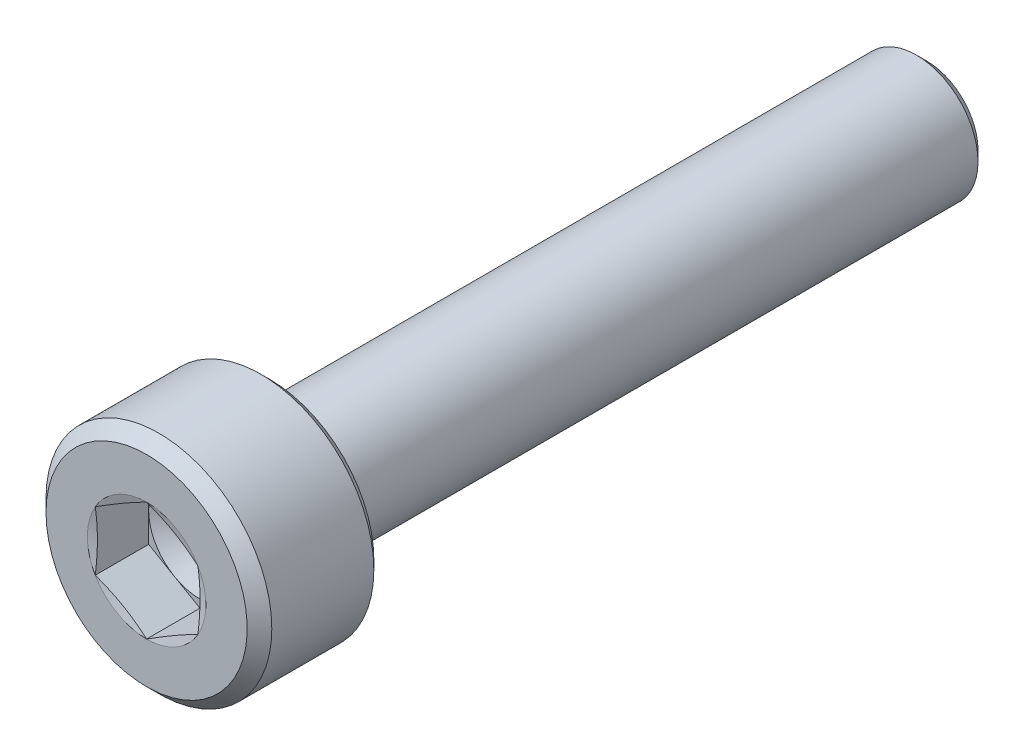
ISO-10303-21;
HEADER;
FILE_DESCRIPTION(('STEP AP214'),'2;1');
FILE_NAME('part.step','',(''),(''),'','','');
FILE_SCHEMA(('AUTOMOTIVE_DESIGN { 1 0 10303 214 1 1 1 1 }'));
ENDSEC;
DATA;
#1=APPLICATION_CONTEXT('core data for automotive mechanical design processes');
#2=APPLICATION_PROTOCOL_DEFINITION('international standard','automotive_design',2000,#1);
#3=PRODUCT_CONTEXT('',#1,'mechanical');
#4=PRODUCT('Part','Part','',(#3));
#5=PRODUCT_RELATED_PRODUCT_CATEGORY('part','',(#4));
#6=PRODUCT_DEFINITION_FORMATION('','',#4);
#7=PRODUCT_DEFINITION_CONTEXT('part definition',#1,'design');
#8=PRODUCT_DEFINITION('design','',#6,#7);
#9=PRODUCT_DEFINITION_SHAPE('','',#8);
#10=(LENGTH_UNIT() NAMED_UNIT(*) SI_UNIT(.MILLI.,.METRE.));
#11=(NAMED_UNIT(*) PLANE_ANGLE_UNIT() SI_UNIT($,.RADIAN.));
#12=(NAMED_UNIT(*) SI_UNIT($,.STERADIAN.) SOLID_ANGLE_UNIT());
#13=UNCERTAINTY_MEASURE_WITH_UNIT(LENGTH_MEASURE(1.E-05),#10,'distance_accuracy_value','');
#14=(GEOMETRIC_REPRESENTATION_CONTEXT(3) GLOBAL_UNCERTAINTY_ASSIGNED_CONTEXT((#13)) GLOBAL_UNIT_ASSIGNED_CONTEXT((#10,
#11,#12)) REPRESENTATION_CONTEXT('',''));
#15=CARTESIAN_POINT('',(0.,0.,0.));
#16=DIRECTION('',(0.,0.,1.));
#17=DIRECTION('',(1.,0.,0.));
#18=AXIS2_PLACEMENT_3D('',#15,#16,#17);
#19=CARTESIAN_POINT('',(1.25,0.721687836487033,-1.3));
#20=DIRECTION('',(0.5,0.866025403784439,0.));
#21=DIRECTION('',(0.,0.,-1.));
#22=AXIS2_PLACEMENT_3D('',#19,#20,#21);
#23=PLANE('',#22);
#24=CARTESIAN_POINT('',(0.,1.44337567297407,0.));
#25=CARTESIAN_POINT('',(0.0266010741574035,1.42801550344856,-0.00411563079121512));
#26=CARTESIAN_POINT('',(0.0532235716252887,1.41263958063488,-0.00803870308418439));
#27=CARTESIAN_POINT('',(0.105990950310015,1.38216656964672,-0.0153837682666469));
#28=CARTESIAN_POINT('',(0.132134938423043,1.36706993862756,-0.0188140917976724));
#29=CARTESIAN_POINT('',(0.184080896535333,1.33708618540438,-0.025174957981675));
#30=CARTESIAN_POINT('',(0.209882172940569,1.32219928511393,-0.0281121725270214));
#31=CARTESIAN_POINT('',(0.261290419336476,1.29254695927157,-0.0334872092687405));
#32=CARTESIAN_POINT('',(0.286897013202713,1.27778166527025,-0.0359293451582305));
#33=CARTESIAN_POINT('',(0.338814014231531,1.24779551622449,-0.0403875802559015));
#34=CARTESIAN_POINT('',(0.365124701320746,1.23257315304511,-0.0423903504078004));
#35=CARTESIAN_POINT('',(0.41739626342825,1.20233457949772,-0.0458161323987716));
#36=CARTESIAN_POINT('',(0.443356722749427,1.18731855544823,-0.0472470738867774));
#37=CARTESIAN_POINT('',(0.495189289691946,1.15738161600266,-0.0495320426407517));
#38=CARTESIAN_POINT('',(0.521061212339776,1.14246059341946,-0.0503888439825338));
#39=CARTESIAN_POINT('',(0.572960169546127,1.112545265764,-0.0515316995489692));
#40=CARTESIAN_POINT('',(0.598987292307348,1.09755099650677,-0.0518146703940937));
#41=CARTESIAN_POINT('',(0.651001958011103,1.06751871961563,-0.0518150403478976));
#42=CARTESIAN_POINT('',(0.676989512865152,1.0524807326171,-0.0515326731292534));
#43=CARTESIAN_POINT('',(0.728831950621195,1.02250093089559,-0.0503906133892446));
#44=CARTESIAN_POINT('',(0.754686839083206,1.00755901473306,-0.049533851076964));
#45=CARTESIAN_POINT('',(0.806530383134818,0.977641594560691,-0.0472488111413174));
#46=CARTESIAN_POINT('',(0.832519038985485,0.962666316501925,-0.0458176006639986));
#47=CARTESIAN_POINT('',(0.88485675257379,0.932508881624223,-0.0423912966395548));
#48=CARTESIAN_POINT('',(0.911205415535616,0.917326964095512,-0.0403881252485901));
#49=CARTESIAN_POINT('',(0.963136866609753,0.88735267068188,-0.035930182334875));
#50=CARTESIAN_POINT('',(0.988721142724691,0.872560833289737,-0.0334890493531678));
#51=CARTESIAN_POINT('',(1.04009703212967,0.842869124815658,-0.028115294806166));
#52=CARTESIAN_POINT('',(1.0658883492984,0.827969535565703,-0.0251782943883381));
#53=CARTESIAN_POINT('',(1.11782834522753,0.797976194945342,-0.0188173828427319));
#54=CARTESIAN_POINT('',(1.14397648287602,0.782882943312323,-0.0153867360503964));
#55=CARTESIAN_POINT('',(1.19675851906724,0.752418637222199,-0.0080404922123379));
#56=CARTESIAN_POINT('',(1.22339156591776,0.737048126643099,-0.00411650230644957));
#57=CARTESIAN_POINT('',(1.25,0.721687836487034,0.));
#58=B_SPLINE_CURVE_WITH_KNOTS('',3,(#24,#25,#26,#27,#28,#29,#30,#31,#32,#33,#34,#35,#36,#37,#38,
#39,#40,#41,#42,#43,#44,#45,#46,#47,#48,#49,#50,#51,#52,#53,#54,#55,#56,#57),.UNSPECIFIED.,.F.,
.F.,(4,2,2,2,2,2,2,2,2,2,2,2,2,2,2,2,4),(0.,0.0929756429984322,0.184124524266457,
0.273918330281164,0.362892504558264,0.454276274812247,0.544344744756976,0.633974830661911,
0.724085265734565,0.814158462912087,0.903775623702066,0.993856267691678,1.0852780295682,
1.17423384973417,1.26402077718908,1.35517544424662,1.44817056877235),.UNSPECIFIED.);
#59=CARTESIAN_POINT('',(0.,1.44337567297406,0.));
#60=VERTEX_POINT('',#59);
#61=CARTESIAN_POINT('',(1.25,0.721687836487034,0.));
#62=VERTEX_POINT('',#61);
#63=EDGE_CURVE('E242',#60,#62,#58,.T.);
#64=ORIENTED_EDGE('',*,*,#63,.F.);
#65=DIRECTION('',(0.,0.,1.));
#66=VECTOR('',#65,1.);
#67=CARTESIAN_POINT('',(0.,1.44337567297406,-1.3));
#68=LINE('',#67,#66);
#69=CARTESIAN_POINT('',(0.,1.44337567297406,-1.3));
#70=VERTEX_POINT('',#69);
#71=EDGE_CURVE('E289',#70,#60,#68,.T.);
#72=ORIENTED_EDGE('',*,*,#71,.F.);
#73=DIRECTION('',(-0.866025403784439,0.5,0.));
#74=VECTOR('',#73,1.);
#75=CARTESIAN_POINT('',(1.25,0.721687836487033,-1.3));
#76=LINE('',#75,#74);
#77=CARTESIAN_POINT('',(0.625,1.08253175473055,-1.3));
#78=VERTEX_POINT('',#77);
#79=EDGE_CURVE('E185',#78,#70,#76,.T.);
#80=ORIENTED_EDGE('',*,*,#79,.F.);
#81=DIRECTION('',(-0.866025403784439,0.5,0.));
#82=VECTOR('',#81,1.);
#83=CARTESIAN_POINT('',(1.25,0.721687836487033,-1.3));
#84=LINE('',#83,#82);
#85=CARTESIAN_POINT('',(1.25,0.721687836487033,-1.3));
#86=VERTEX_POINT('',#85);
#87=EDGE_CURVE('E229',#86,#78,#84,.T.);
#88=ORIENTED_EDGE('',*,*,#87,.F.);
#89=DIRECTION('',(0.,0.,1.));
#90=VECTOR('',#89,1.);
#91=CARTESIAN_POINT('',(1.25,0.721687836487033,-1.3));
#92=LINE('',#91,#90);
#93=EDGE_CURVE('E11',#86,#62,#92,.T.);
#94=ORIENTED_EDGE('',*,*,#93,.T.);
#95=EDGE_LOOP('',(#64,#72,#80,#88,#94));
#96=FACE_BOUND('',#95,.T.);
#97=ADVANCED_FACE('F16',(#96),#23,.F.);
#98=CARTESIAN_POINT('',(1.25,-0.721687836487033,-1.3));
#99=DIRECTION('',(1.,0.,0.));
#100=DIRECTION('',(0.,-1.,0.));
#101=AXIS2_PLACEMENT_3D('',#98,#99,#100);
#102=PLANE('',#101);
#103=CARTESIAN_POINT('',(1.25,0.721687836487034,0.));
#104=CARTESIAN_POINT('',(1.24999823698251,0.690999940764968,-0.0041116921545435));
#105=CARTESIAN_POINT('',(1.24999343638009,0.660285670486277,-0.0080312219209347));
#106=CARTESIAN_POINT('',(1.24998639785537,0.599409952891843,-0.0153701172192225));
#107=CARTESIAN_POINT('',(1.24998411141551,0.569249506080653,-0.0187977996777385));
#108=CARTESIAN_POINT('',(1.24998996305486,0.509329780508077,-0.0251543025812117));
#109=CARTESIAN_POINT('',(1.24999794646817,0.479571212976206,-0.0280897892747288));
#110=CARTESIAN_POINT('',(1.2500223367559,0.420283812845672,-0.0334622466755174));
#111=CARTESIAN_POINT('',(1.25003866580902,0.39075537251126,-0.0359035370987912));
#112=CARTESIAN_POINT('',(1.25002873622066,0.330797047066719,-0.0403659968356117));
#113=CARTESIAN_POINT('',(1.25000121650915,0.300366084889518,-0.0423727707061422));
#114=CARTESIAN_POINT('',(1.2499487716613,0.239913774778711,-0.0458055537624093));
#115=CARTESIAN_POINT('',(1.24992381469335,0.209892884574225,-0.0472395610352221));
#116=CARTESIAN_POINT('',(1.24991464001477,0.149977872401545,-0.0495283234961986));
#117=CARTESIAN_POINT('',(1.24993022107687,0.120083859273445,-0.0503859133498061));
#118=CARTESIAN_POINT('',(1.24996835071472,0.0601265989330451,-0.0515327901252948));
#119=CARTESIAN_POINT('',(1.24999093574578,0.030063293747345,-0.0518190439098863));
#120=CARTESIAN_POINT('',(1.25,0.,-0.0518148554092244));
#121=B_SPLINE_CURVE_WITH_KNOTS('',3,(#103,#104,#105,#106,#107,#108,#109,#110,#111,#112,#113,
#114,#115,#116,#117,#118,#119,#120),.UNSPECIFIED.,.F.,.F.,(4,2,2,2,2,2,2,2,4),(0.,
0.0928866686125054,0.18394754574854,0.273652950549812,0.362536731833363,0.454023240761691,
0.544183383798673,0.633896834523419,0.72408530693755),.UNSPECIFIED.);
#122=CARTESIAN_POINT('',(1.25,0.,-0.0518148554092244));
#123=VERTEX_POINT('',#122);
#124=EDGE_CURVE('E206',#62,#123,#121,.T.);
#125=ORIENTED_EDGE('',*,*,#124,.F.);
#126=ORIENTED_EDGE('',*,*,#93,.F.);
#127=DIRECTION('',(0.,1.,0.));
#128=VECTOR('',#127,1.);
#129=CARTESIAN_POINT('',(1.25,-0.721687836487033,-1.3));
#130=LINE('',#129,#128);
#131=CARTESIAN_POINT('',(1.25,0.,-1.3));
#132=VERTEX_POINT('',#131);
#133=EDGE_CURVE('E233',#132,#86,#130,.T.);
#134=ORIENTED_EDGE('',*,*,#133,.F.);
#135=DIRECTION('',(0.,1.,0.));
#136=VECTOR('',#135,1.);
#137=CARTESIAN_POINT('',(1.25,-0.721687836487033,-1.3));
#138=LINE('',#137,#136);
#139=CARTESIAN_POINT('',(1.25,-0.721687836487033,-1.3));
#140=VERTEX_POINT('',#139);
#141=EDGE_CURVE('E173',#140,#132,#138,.T.);
#142=ORIENTED_EDGE('',*,*,#141,.F.);
#143=DIRECTION('',(0.,0.,1.));
#144=VECTOR('',#143,1.);
#145=CARTESIAN_POINT('',(1.25,-0.721687836487033,-1.3));
#146=LINE('',#145,#144);
#147=CARTESIAN_POINT('',(1.25,-0.721687836487031,0.));
#148=VERTEX_POINT('',#147);
#149=EDGE_CURVE('E30',#140,#148,#146,.T.);
#150=ORIENTED_EDGE('',*,*,#149,.T.);
#151=CARTESIAN_POINT('',(1.25,0.,-0.0518148554092244));
#152=CARTESIAN_POINT('',(1.24999097697891,-0.0300388242332713,-0.0518190278008075));
#153=CARTESIAN_POINT('',(1.24996934760271,-0.0600776555269679,-0.0515329955368294));
#154=CARTESIAN_POINT('',(1.24993379974361,-0.119991561939784,-0.05038720494537));
#155=CARTESIAN_POINT('',(1.24991984260544,-0.149866692950213,-0.0495303717689572));
#156=CARTESIAN_POINT('',(1.24993183671915,-0.209749120653996,-0.0472437357421163));
#157=CARTESIAN_POINT('',(1.24995799405163,-0.239756304838218,-0.0458110022567921));
#158=CARTESIAN_POINT('',(1.25001075989497,-0.300186021092445,-0.0423815066628743));
#159=CARTESIAN_POINT('',(1.25003736932907,-0.330608091422305,-0.040376671117203));
#160=CARTESIAN_POINT('',(1.2500446486428,-0.39057222202749,-0.0359167393057105));
#161=CARTESIAN_POINT('',(1.25002656990743,-0.420115329127233,-0.0334756444191961));
#162=CARTESIAN_POINT('',(1.24999981108288,-0.479432961970562,-0.0281026849191924));
#163=CARTESIAN_POINT('',(1.24999121968782,-0.509207093749055,-0.0251664799491732));
#164=CARTESIAN_POINT('',(1.24998452367544,-0.569159340782016,-0.0188078031597437));
#165=CARTESIAN_POINT('',(1.24998657991599,-0.599336742030467,-0.0153786379059865));
#166=CARTESIAN_POINT('',(1.24999338873797,-0.660248180215888,-0.00803601627135115));
#167=CARTESIAN_POINT('',(1.24999819468793,-0.690981212849153,-0.0041142106816611));
#168=CARTESIAN_POINT('',(1.25,-0.72168783648703,0.));
#169=B_SPLINE_CURVE_WITH_KNOTS('',3,(#151,#152,#153,#154,#155,#156,#157,#158,#159,#160,#161,
#162,#163,#164,#165,#166,#167,#168),.UNSPECIFIED.,.F.,.F.,(4,2,2,2,2,2,2,2,4),(0.,
0.0901150585143207,0.179771826003305,0.26989073371865,0.361350251095626,0.450277827988882,
0.540029901554553,0.631141813166489,0.72408517261877),.UNSPECIFIED.);
#170=EDGE_CURVE('E162',#123,#148,#169,.T.);
#171=ORIENTED_EDGE('',*,*,#170,.F.);
#172=EDGE_LOOP('',(#125,#126,#134,#142,#150,#171));
#173=FACE_BOUND('',#172,.T.);
#174=ADVANCED_FACE('F322',(#173),#102,.F.);
#175=CARTESIAN_POINT('',(0.,-1.44337567297406,-1.3));
#176=DIRECTION('',(0.5,-0.866025403784439,0.));
#177=DIRECTION('',(0.,0.,-1.));
#178=AXIS2_PLACEMENT_3D('',#175,#176,#177);
#179=PLANE('',#178);
#180=CARTESIAN_POINT('',(1.25,-0.72168783648703,0.));
#181=CARTESIAN_POINT('',(1.2233971659058,-0.737044957712528,-0.00411563079121149));
#182=CARTESIAN_POINT('',(1.19676997740861,-0.752412755425053,-0.00803870308417673));
#183=CARTESIAN_POINT('',(1.14399588642073,-0.782874140363045,-0.0153837682666341));
#184=CARTESIAN_POINT('',(1.11784982639007,-0.797967182715585,-0.018814091797658));
#185=CARTESIAN_POINT('',(1.06591015534185,-0.827961825453168,-0.0251749579816608));
#186=CARTESIAN_POINT('',(1.04011708330409,-0.842862936124947,-0.0281121725270084));
#187=CARTESIAN_POINT('',(0.988733292645323,-0.872557620546649,-0.0334872092687323));
#188=CARTESIAN_POINT('',(0.963142876012687,-0.88735093433855,-0.0359293451582256));
#189=CARTESIAN_POINT('',(0.91121560866282,-0.917319301594997,-0.0403875802559157));
#190=CARTESIAN_POINT('',(0.884877311899103,-0.932493843415649,-0.0423903504078287));
#191=CARTESIAN_POINT('',(0.832554157978914,-0.962643057322603,-0.0458161323988174));
#192=CARTESIAN_POINT('',(0.806569670027579,-0.977617462563912,-0.0472470738868286));
#193=CARTESIAN_POINT('',(0.754727236484892,-1.00753731255668,-0.0495320426408034));
#194=CARTESIAN_POINT('',(0.728869290553528,-1.02248254352281,-0.0503888439825823));
#195=CARTESIAN_POINT('',(0.677012378238376,-1.05247069506564,-0.0515316995489991));
#196=CARTESIAN_POINT('',(0.651013398769965,-1.06751370993562,-0.0518146703941098));
#197=CARTESIAN_POINT('',(0.598997351197246,-1.09754359335878,-0.051815040347882));
#198=CARTESIAN_POINT('',(0.57298029500795,-1.11253048254531,-0.0515326731292214));
#199=CARTESIAN_POINT('',(0.521095806239011,-1.14243744977536,-0.0503906133891943));
#200=CARTESIAN_POINT('',(0.495228283030122,-1.15735748191422,-0.0495338510769088));
#201=CARTESIAN_POINT('',(0.443397265119366,-1.18729659799899,-0.0472488111412611));
#202=CARTESIAN_POINT('',(0.417433965966339,-1.20231579514653,-0.0458176006639436));
#203=CARTESIAN_POINT('',(0.365148004454804,-1.2325628672512,-0.0423912966395229));
#204=CARTESIAN_POINT('',(0.338825746715614,-1.24779051996754,-0.0403881252485777));
#205=CARTESIAN_POINT('',(0.28690152162188,-1.27777732914604,-0.0359301823349323));
#206=CARTESIAN_POINT('',(0.261299276614448,-1.29253804350266,-0.0334890493532856));
#207=CARTESIAN_POINT('',(0.209897558092061,-1.32218501463202,-0.0281152948063626));
#208=CARTESIAN_POINT('',(0.184098476711416,-1.33707115587218,-0.025178294388549));
#209=CARTESIAN_POINT('',(0.13215348382532,-1.36705584150914,-0.0188173828429405));
#210=CARTESIAN_POINT('',(0.106008275661093,-1.38215416715798,-0.0153867360505843));
#211=CARTESIAN_POINT('',(0.0532343945823571,-1.41263259831833,-0.00804049221245096));
#212=CARTESIAN_POINT('',(0.0266066185261265,-1.42801223818175,-0.00411650230650442));
#213=CARTESIAN_POINT('',(0.,-1.44337567297406,0.));
#214=B_SPLINE_CURVE_WITH_KNOTS('',3,(#180,#181,#182,#183,#184,#185,#186,#187,#188,#189,#190,
#191,#192,#193,#194,#195,#196,#197,#198,#199,#200,#201,#202,#203,#204,#205,#206,#207,#208,#209,
#210,#211,#212,#213),.UNSPECIFIED.,.F.,.F.,(4,2,2,2,2,2,2,2,2,2,2,2,2,2,2,2,4),(0.,
0.0929756429983488,0.18412452426635,0.273918330281088,0.362892504558272,0.454276274812701,
0.544344744757564,0.633974830662343,0.72408526573457,0.814158462911407,0.903775623701171,
0.993856267691015,1.0852780295682,1.17423384973301,1.26402077718748,1.3551754442454,
1.44817056877235),.UNSPECIFIED.);
#215=CARTESIAN_POINT('',(0.,-1.44337567297406,0.));
#216=VERTEX_POINT('',#215);
#217=EDGE_CURVE('E426',#148,#216,#214,.T.);
#218=ORIENTED_EDGE('',*,*,#217,.F.);
#219=ORIENTED_EDGE('',*,*,#149,.F.);
#220=DIRECTION('',(0.866025403784439,0.5,0.));
#221=VECTOR('',#220,1.);
#222=CARTESIAN_POINT('',(0.,-1.44337567297406,-1.3));
#223=LINE('',#222,#221);
#224=CARTESIAN_POINT('',(0.625,-1.08253175473055,-1.3));
#225=VERTEX_POINT('',#224);
#226=EDGE_CURVE('E214',#225,#140,#223,.T.);
#227=ORIENTED_EDGE('',*,*,#226,.F.);
#228=DIRECTION('',(0.866025403784439,0.5,0.));
#229=VECTOR('',#228,1.);
#230=CARTESIAN_POINT('',(0.,-1.44337567297406,-1.3));
#231=LINE('',#230,#229);
#232=CARTESIAN_POINT('',(0.,-1.44337567297406,-1.3));
#233=VERTEX_POINT('',#232);
#234=EDGE_CURVE('E172',#233,#225,#231,.T.);
#235=ORIENTED_EDGE('',*,*,#234,.F.);
#236=DIRECTION('',(0.,0.,1.));
#237=VECTOR('',#236,1.);
#238=CARTESIAN_POINT('',(0.,-1.44337567297406,-1.3));
#239=LINE('',#238,#237);
#240=EDGE_CURVE('E461',#233,#216,#239,.T.);
#241=ORIENTED_EDGE('',*,*,#240,.T.);
#242=EDGE_LOOP('',(#218,#219,#227,#235,#241));
#243=FACE_BOUND('',#242,.T.);
#244=ADVANCED_FACE('F326',(#243),#179,.F.);
#245=CARTESIAN_POINT('',(-1.25,-0.721687836487032,-1.3));
#246=DIRECTION('',(-0.5,-0.866025403784439,0.));
#247=DIRECTION('',(-0.866025403784439,0.5,0.));
#248=AXIS2_PLACEMENT_3D('',#245,#246,#247);
#249=PLANE('',#248);
#250=CARTESIAN_POINT('',(0.,-1.44337567297406,0.));
#251=CARTESIAN_POINT('',(-0.0266010741573072,-1.42801550344862,-0.00411563079120053));
#252=CARTESIAN_POINT('',(-0.0532235716251028,-1.412639580635,-0.00803870308415418));
#253=CARTESIAN_POINT('',(-0.105990950309719,-1.38216656964693,-0.0153837682665966));
#254=CARTESIAN_POINT('',(-0.132134938422726,-1.3670699386278,-0.0188140917976166));
#255=CARTESIAN_POINT('',(-0.184080896535033,-1.33708618540464,-0.0251749579816186));
#256=CARTESIAN_POINT('',(-0.209882172940307,-1.32219928511417,-0.0281121725269688));
#257=CARTESIAN_POINT('',(-0.261290419336326,-1.29254695927172,-0.0334872092687093));
#258=CARTESIAN_POINT('',(-0.286897013202638,-1.27778166527032,-0.0359293451582158));
#259=CARTESIAN_POINT('',(-0.338814014231424,-1.24779551622451,-0.0403875802559013));
#260=CARTESIAN_POINT('',(-0.365124701320532,-1.23257315304517,-0.0423903504078018));
#261=CARTESIAN_POINT('',(-0.417396263427902,-1.20233457949783,-0.0458161323987747));
#262=CARTESIAN_POINT('',(-0.443356722749052,-1.18731855544836,-0.0472470738867794));
#263=CARTESIAN_POINT('',(-0.495189289691583,-1.15738161600281,-0.0495320426407528));
#264=CARTESIAN_POINT('',(-0.521061212339452,-1.14246059341961,-0.0503888439825337));
#265=CARTESIAN_POINT('',(-0.572960169545936,-1.11254526576409,-0.0515316995489712));
#266=CARTESIAN_POINT('',(-0.59898729230725,-1.09755099650681,-0.0518146703940977));
#267=CARTESIAN_POINT('',(-0.651001958010772,-1.06751871961583,-0.0518150403478942));
#268=CARTESIAN_POINT('',(-0.676989512864494,-1.05248073261752,-0.0515326731292499));
#269=CARTESIAN_POINT('',(-0.728831950620127,-1.02250093089636,-0.0503906133892435));
#270=CARTESIAN_POINT('',(-0.754686839082053,-1.00755901473394,-0.0495338510769603));
#271=CARTESIAN_POINT('',(-0.806530383133706,-0.97764159456164,-0.0472488111413116));
#272=CARTESIAN_POINT('',(-0.832519038984498,-0.962666316502832,-0.0458176006639886));
#273=CARTESIAN_POINT('',(-0.884856752573216,-0.932508881624801,-0.0423912966395508));
#274=CARTESIAN_POINT('',(-0.911205415535328,-0.917326964095802,-0.0403881252485919));
#275=CARTESIAN_POINT('',(-0.963136866609371,-0.887352670681979,-0.0359301823349303));
#276=CARTESIAN_POINT('',(-0.98872114272393,-0.872560833289935,-0.0334890493532837));
#277=CARTESIAN_POINT('',(-1.04009703212842,-0.842869124816045,-0.0281152948063605));
#278=CARTESIAN_POINT('',(-1.06588834929704,-0.827969535566183,-0.0251782943885465));
#279=CARTESIAN_POINT('',(-1.11782834522619,-0.797976194945903,-0.0188173828429378));
#280=CARTESIAN_POINT('',(-1.1439764828748,-0.782882943312871,-0.0153867360505819));
#281=CARTESIAN_POINT('',(-1.19675851906652,-0.752418637222568,-0.00804049221244955));
#282=CARTESIAN_POINT('',(-1.22339156591741,-0.7370481266433,-0.00411650230650377));
#283=CARTESIAN_POINT('',(-1.25,-0.721687836487036,0.));
#284=B_SPLINE_CURVE_WITH_KNOTS('',3,(#250,#251,#252,#253,#254,#255,#256,#257,#258,#259,#260,
#261,#262,#263,#264,#265,#266,#267,#268,#269,#270,#271,#272,#273,#274,#275,#276,#277,#278,#279,
#280,#281,#282,#283),.UNSPECIFIED.,.F.,.F.,(4,2,2,2,2,2,2,2,2,2,2,2,2,2,2,2,4),(0.,
0.0929756429981014,0.184124524266029,0.273918330280853,0.362892504558266,0.454276274811929,
0.544344744756552,0.633974830661595,0.724085265734569,0.814158462910913,0.9037756237005,
0.993856267690502,1.0852780295682,1.17423384973303,1.2640207771875,1.35517544424541,
1.44817056877234),.UNSPECIFIED.);
#285=CARTESIAN_POINT('',(-1.25,-0.721687836487033,0.));
#286=VERTEX_POINT('',#285);
#287=EDGE_CURVE('E457',#216,#286,#284,.T.);
#288=ORIENTED_EDGE('',*,*,#287,.F.);
#289=ORIENTED_EDGE('',*,*,#240,.F.);
#290=DIRECTION('',(0.866025403784439,-0.5,0.));
#291=VECTOR('',#290,1.);
#292=CARTESIAN_POINT('',(-1.25,-0.721687836487032,-1.3));
#293=LINE('',#292,#291);
#294=CARTESIAN_POINT('',(-0.625,-1.08253175473055,-1.3));
#295=VERTEX_POINT('',#294);
#296=EDGE_CURVE('E168',#295,#233,#293,.T.);
#297=ORIENTED_EDGE('',*,*,#296,.F.);
#298=DIRECTION('',(0.866025403784439,-0.5,0.));
#299=VECTOR('',#298,1.);
#300=CARTESIAN_POINT('',(-1.25,-0.721687836487032,-1.3));
#301=LINE('',#300,#299);
#302=CARTESIAN_POINT('',(-1.25,-0.721687836487032,-1.3));
#303=VERTEX_POINT('',#302);
#304=EDGE_CURVE('E186',#303,#295,#301,.T.);
#305=ORIENTED_EDGE('',*,*,#304,.F.);
#306=DIRECTION('',(0.,0.,1.));
#307=VECTOR('',#306,1.);
#308=CARTESIAN_POINT('',(-1.25,-0.721687836487032,-1.3));
#309=LINE('',#308,#307);
#310=EDGE_CURVE('E402',#303,#286,#309,.T.);
#311=ORIENTED_EDGE('',*,*,#310,.T.);
#312=EDGE_LOOP('',(#288,#289,#297,#305,#311));
#313=FACE_BOUND('',#312,.T.);
#314=ADVANCED_FACE('F272',(#313),#249,.F.);
#315=CARTESIAN_POINT('',(-1.25,0.721687836487033,-1.3));
#316=DIRECTION('',(-1.,0.,0.));
#317=DIRECTION('',(0.,0.,1.));
#318=AXIS2_PLACEMENT_3D('',#315,#316,#317);
#319=PLANE('',#318);
#320=CARTESIAN_POINT('',(-1.25,-0.721687836487036,0.));
#321=CARTESIAN_POINT('',(-1.24999821886412,-0.690932210000902,-0.00412077366792503));
#322=CARTESIAN_POINT('',(-1.24999387857277,-0.660150074866336,-0.00804841753616333));
#323=CARTESIAN_POINT('',(-1.24998827175687,-0.599138517352571,-0.0154014380852009));
#324=CARTESIAN_POINT('',(-1.24998694660483,-0.568910098118886,-0.0188351562390941));
#325=CARTESIAN_POINT('',(-1.24999480562822,-0.508853302588297,-0.0252016317976271));
#326=CARTESIAN_POINT('',(-1.25000383433192,-0.479025637483938,-0.0281410598390331));
#327=CARTESIAN_POINT('',(-1.25002969465079,-0.419597741693308,-0.0335193354014606));
#328=CARTESIAN_POINT('',(-1.25004645478338,-0.389997900664602,-0.0359624795469015));
#329=CARTESIAN_POINT('',(-1.25003624698015,-0.329932451723906,-0.0404235084844104));
#330=CARTESIAN_POINT('',(-1.25000804135667,-0.299465811483142,-0.0424275685535516));
#331=CARTESIAN_POINT('',(-1.24995480282112,-0.238942721030509,-0.0458531334643784));
#332=CARTESIAN_POINT('',(-1.24992972983623,-0.208886728419523,-0.0472826637209089));
#333=CARTESIAN_POINT('',(-1.24991813207592,-0.148900847883205,-0.0495620346762597));
#334=CARTESIAN_POINT('',(-1.24993141807717,-0.11897106783738,-0.0504146953997261));
#335=CARTESIAN_POINT('',(-1.24997269319909,-0.0589403752630816,-0.0515465360951228));
#336=CARTESIAN_POINT('',(-1.25000076068601,-0.0288394047107543,-0.0518226201453485));
#337=CARTESIAN_POINT('',(-1.24999924183589,0.0312625879908033,-0.051806775859687));
#338=CARTESIAN_POINT('',(-1.24996984632998,0.0612636106529509,-0.051516727619696));
#339=CARTESIAN_POINT('',(-1.24992780073287,0.121103798973637,-0.0503604178239));
#340=CARTESIAN_POINT('',(-1.24991506723406,0.150943020383787,-0.049497059210113));
#341=CARTESIAN_POINT('',(-1.24992723273208,0.21075428356878,-0.0471998946158216));
#342=CARTESIAN_POINT('',(-1.2499523271874,0.240726211851809,-0.0457631542002465));
#343=CARTESIAN_POINT('',(-1.25000360417568,0.301084835090529,-0.0423268298904389));
#344=CARTESIAN_POINT('',(-1.25002979734107,0.331471068197909,-0.0403191918787037));
#345=CARTESIAN_POINT('',(-1.25003699758531,0.391328089389752,-0.0358577918245045));
#346=CARTESIAN_POINT('',(-1.25001928795661,0.42079996858613,-0.0334185904444356));
#347=CARTESIAN_POINT('',(-1.24999394681244,0.479977430952503,-0.0280514827152005));
#348=CARTESIAN_POINT('',(-1.24998641124457,0.509682617587425,-0.0251192130216116));
#349=CARTESIAN_POINT('',(-1.24998172156504,0.569498085241384,-0.0187704983671833));
#350=CARTESIAN_POINT('',(-1.24998472717054,0.599607652246593,-0.0153473647873735));
#351=CARTESIAN_POINT('',(-1.2499929474011,0.660383517909659,-0.00801885284655767));
#352=CARTESIAN_POINT('',(-1.24999820530047,0.691048814920108,-0.00410514993995136));
#353=CARTESIAN_POINT('',(-1.25,0.721687836487032,0.));
#354=B_SPLINE_CURVE_WITH_KNOTS('',3,(#320,#321,#322,#323,#324,#325,#326,#327,#328,#329,#330,
#331,#332,#333,#334,#335,#336,#337,#338,#339,#340,#341,#342,#343,#344,#345,#346,#347,#348,#349,
#350,#351,#352,#353),.UNSPECIFIED.,.F.,.F.,(4,2,2,2,2,2,2,2,2,2,2,2,2,2,2,2,4),(0.,
0.0930916808948182,0.184357193016995,0.274270023536689,0.363367712388216,0.454960459263653,
0.545225160616974,0.635045351768193,0.725346604253175,0.815348481166214,0.904898075925872,
0.994911965590393,1.0862647637543,1.17497894838529,1.26452405113569,1.35543174170835,
1.44817047837161),.UNSPECIFIED.);
#355=CARTESIAN_POINT('',(-1.25,0.721687836487033,0.));
#356=VERTEX_POINT('',#355);
#357=EDGE_CURVE('E469',#286,#356,#354,.T.);
#358=ORIENTED_EDGE('',*,*,#357,.F.);
#359=ORIENTED_EDGE('',*,*,#310,.F.);
#360=DIRECTION('',(0.,-1.,0.));
#361=VECTOR('',#360,1.);
#362=CARTESIAN_POINT('',(-1.25,0.721687836487033,-1.3));
#363=LINE('',#362,#361);
#364=CARTESIAN_POINT('',(-1.25,0.,-1.3));
#365=VERTEX_POINT('',#364);
#366=EDGE_CURVE('E190',#365,#303,#363,.T.);
#367=ORIENTED_EDGE('',*,*,#366,.F.);
#368=DIRECTION('',(0.,-1.,0.));
#369=VECTOR('',#368,1.);
#370=CARTESIAN_POINT('',(-1.25,0.721687836487033,-1.3));
#371=LINE('',#370,#369);
#372=CARTESIAN_POINT('',(-1.25,0.721687836487033,-1.3));
#373=VERTEX_POINT('',#372);
#374=EDGE_CURVE('E166',#373,#365,#371,.T.);
#375=ORIENTED_EDGE('',*,*,#374,.F.);
#376=DIRECTION('',(0.,0.,1.));
#377=VECTOR('',#376,1.);
#378=CARTESIAN_POINT('',(-1.25,0.721687836487033,-1.3));
#379=LINE('',#378,#377);
#380=EDGE_CURVE('E45',#373,#356,#379,.T.);
#381=ORIENTED_EDGE('',*,*,#380,.T.);
#382=EDGE_LOOP('',(#358,#359,#367,#375,#381));
#383=FACE_BOUND('',#382,.T.);
#384=ADVANCED_FACE('F267',(#383),#319,.F.);
#385=CARTESIAN_POINT('',(0.,1.44337567297406,-1.3));
#386=DIRECTION('',(-0.5,0.866025403784439,0.));
#387=DIRECTION('',(0.,0.,1.));
#388=AXIS2_PLACEMENT_3D('',#385,#386,#387);
#389=PLANE('',#388);
#390=CARTESIAN_POINT('',(-1.25,0.721687836487032,0.));
#391=CARTESIAN_POINT('',(-1.22339716590584,0.737044957712511,-0.00411563079120637));
#392=CARTESIAN_POINT('',(-1.19676997740868,0.752412755425021,-0.00803870308416613));
#393=CARTESIAN_POINT('',(-1.14399588642084,0.782874140362995,-0.0153837682666164));
#394=CARTESIAN_POINT('',(-1.1178498263902,0.797967182715534,-0.0188140917976384));
#395=CARTESIAN_POINT('',(-1.06591015534198,0.827961825453124,-0.0251749579816409));
#396=CARTESIAN_POINT('',(-1.04011708330421,0.842862936124911,-0.0281121725269898));
#397=CARTESIAN_POINT('',(-0.988733292645396,0.87255762054663,-0.0334872092687212));
#398=CARTESIAN_POINT('',(-0.963142876012725,0.887350934338539,-0.0359293451582203));
#399=CARTESIAN_POINT('',(-0.911215608662851,0.917319301594967,-0.0403875802559155));
#400=CARTESIAN_POINT('',(-0.884877311899161,0.932493843415591,-0.042390350407829));
#401=CARTESIAN_POINT('',(-0.832554157979012,0.962643057322515,-0.0458161323988182));
#402=CARTESIAN_POINT('',(-0.806569670027688,0.97761746256382,-0.0472470738868289));
#403=CARTESIAN_POINT('',(-0.754727236485004,1.00753731255659,-0.0495320426408036));
#404=CARTESIAN_POINT('',(-0.728869290553631,1.02248254352274,-0.0503888439825824));
#405=CARTESIAN_POINT('',(-0.677012378238439,1.0524706950656,-0.0515316995489988));
#406=CARTESIAN_POINT('',(-0.651013398769998,1.06751370993561,-0.0518146703941088));
#407=CARTESIAN_POINT('',(-0.598997351197131,1.09754359335884,-0.0518150403478823));
#408=CARTESIAN_POINT('',(-0.572980295007719,1.11253048254543,-0.0515326731292221));
#409=CARTESIAN_POINT('',(-0.521095806238615,1.14243744977554,-0.0503906133891946));
#410=CARTESIAN_POINT('',(-0.49522828302968,1.1573574819144,-0.0495338510769098));
#411=CARTESIAN_POINT('',(-0.443397265118909,1.18729659799915,-0.0472488111412628));
#412=CARTESIAN_POINT('',(-0.417433965965914,1.20231579514667,-0.0458176006639467));
#413=CARTESIAN_POINT('',(-0.365148004454539,1.23256286725127,-0.042391296639524));
#414=CARTESIAN_POINT('',(-0.338825746715477,1.24779051996758,-0.0403881252485769));
#415=CARTESIAN_POINT('',(-0.286901521621781,1.27777732914614,-0.0359301823349139));
#416=CARTESIAN_POINT('',(-0.261299276614258,1.29253804350285,-0.0334890493532472));
#417=CARTESIAN_POINT('',(-0.209897558091737,1.32218501463232,-0.0281152948062984));
#418=CARTESIAN_POINT('',(-0.184098476711047,1.33707115587249,-0.0251782943884803));
#419=CARTESIAN_POINT('',(-0.132153483824933,1.36705584150943,-0.0188173828428726));
#420=CARTESIAN_POINT('',(-0.106008275660732,1.38215416715824,-0.0153867360505231));
#421=CARTESIAN_POINT('',(-0.0532343945821315,1.41263259831848,-0.00804049221241403));
#422=CARTESIAN_POINT('',(-0.0266066185260098,1.42801223818181,-0.00411650230648636));
#423=CARTESIAN_POINT('',(0.,1.44337567297407,0.));
#424=B_SPLINE_CURVE_WITH_KNOTS('',3,(#390,#391,#392,#393,#394,#395,#396,#397,#398,#399,#400,
#401,#402,#403,#404,#405,#406,#407,#408,#409,#410,#411,#412,#413,#414,#415,#416,#417,#418,#419,
#420,#421,#422,#423),.UNSPECIFIED.,.F.,.F.,(4,2,2,2,2,2,2,2,2,2,2,2,2,2,2,2,4),(0.,
0.0929756429982334,0.1841245242662,0.273918330280977,0.362892504558266,0.454276274812582,
0.54434474475741,0.633974830662229,0.72408526573457,0.814158462911794,0.903775623701688,
0.993856267691406,1.08527802956821,1.17423384973339,1.264020777188,1.3551754442458,
1.44817056877235),.UNSPECIFIED.);
#425=EDGE_CURVE('E296',#356,#60,#424,.T.);
#426=ORIENTED_EDGE('',*,*,#425,.F.);
#427=ORIENTED_EDGE('',*,*,#380,.F.);
#428=DIRECTION('',(-0.866025403784439,-0.5,0.));
#429=VECTOR('',#428,1.);
#430=CARTESIAN_POINT('',(0.,1.44337567297406,-1.3));
#431=LINE('',#430,#429);
#432=CARTESIAN_POINT('',(-0.625,1.08253175473055,-1.3));
#433=VERTEX_POINT('',#432);
#434=EDGE_CURVE('E184',#433,#373,#431,.T.);
#435=ORIENTED_EDGE('',*,*,#434,.F.);
#436=DIRECTION('',(-0.866025403784439,-0.5,0.));
#437=VECTOR('',#436,1.);
#438=CARTESIAN_POINT('',(0.,1.44337567297406,-1.3));
#439=LINE('',#438,#437);
#440=EDGE_CURVE('E180',#70,#433,#439,.T.);
#441=ORIENTED_EDGE('',*,*,#440,.F.);
#442=ORIENTED_EDGE('',*,*,#71,.T.);
#443=EDGE_LOOP('',(#426,#427,#435,#441,#442));
#444=FACE_BOUND('',#443,.T.);
#445=ADVANCED_FACE('F271',(#444),#389,.F.);
#446=CARTESIAN_POINT('',(0.,0.,-1.3));
#447=DIRECTION('',(0.,0.,1.));
#448=DIRECTION('',(1.,0.,0.));
#449=AXIS2_PLACEMENT_3D('',#446,#447,#448);
#450=PLANE('',#449);
#451=CARTESIAN_POINT('',(0.,0.,-1.3));
#452=DIRECTION('',(0.,0.,1.));
#453=DIRECTION('',(1.,0.,0.));
#454=AXIS2_PLACEMENT_3D('',#451,#452,#453);
#455=CIRCLE('',#454,1.25);
#456=EDGE_CURVE('E194',#433,#365,#455,.T.);
#457=ORIENTED_EDGE('',*,*,#456,.F.);
#458=ORIENTED_EDGE('',*,*,#434,.T.);
#459=ORIENTED_EDGE('',*,*,#374,.T.);
#460=EDGE_LOOP('',(#457,#458,#459));
#461=FACE_BOUND('',#460,.T.);
#462=ADVANCED_FACE('F312',(#461),#450,.T.);
#463=CARTESIAN_POINT('',(0.,0.,-1.3));
#464=DIRECTION('',(0.,0.,1.));
#465=DIRECTION('',(1.,0.,0.));
#466=AXIS2_PLACEMENT_3D('',#463,#464,#465);
#467=PLANE('',#466);
#468=CARTESIAN_POINT('',(0.,0.,-1.3));
#469=DIRECTION('',(0.,0.,1.));
#470=DIRECTION('',(1.,0.,0.));
#471=AXIS2_PLACEMENT_3D('',#468,#469,#470);
#472=CIRCLE('',#471,1.25);
#473=EDGE_CURVE('E203',#78,#433,#472,.T.);
#474=ORIENTED_EDGE('',*,*,#473,.F.);
#475=ORIENTED_EDGE('',*,*,#79,.T.);
#476=ORIENTED_EDGE('',*,*,#440,.T.);
#477=EDGE_LOOP('',(#474,#475,#476));
#478=FACE_BOUND('',#477,.T.);
#479=ADVANCED_FACE('F654',(#478),#467,.T.);
#480=CARTESIAN_POINT('',(0.,0.,-1.3));
#481=DIRECTION('',(0.,0.,1.));
#482=DIRECTION('',(1.,0.,0.));
#483=AXIS2_PLACEMENT_3D('',#480,#481,#482);
#484=PLANE('',#483);
#485=CARTESIAN_POINT('',(0.,0.,-1.3));
#486=DIRECTION('',(0.,0.,1.));
#487=DIRECTION('',(1.,0.,0.));
#488=AXIS2_PLACEMENT_3D('',#485,#486,#487);
#489=CIRCLE('',#488,1.25);
#490=EDGE_CURVE('E179',#365,#295,#489,.T.);
#491=ORIENTED_EDGE('',*,*,#490,.F.);
#492=ORIENTED_EDGE('',*,*,#366,.T.);
#493=ORIENTED_EDGE('',*,*,#304,.T.);
#494=EDGE_LOOP('',(#491,#492,#493));
#495=FACE_BOUND('',#494,.T.);
#496=ADVANCED_FACE('F328',(#495),#484,.T.);
#497=CARTESIAN_POINT('',(0.,0.,-1.3));
#498=DIRECTION('',(0.,0.,1.));
#499=DIRECTION('',(1.,0.,0.));
#500=AXIS2_PLACEMENT_3D('',#497,#498,#499);
#501=PLANE('',#500);
#502=CARTESIAN_POINT('',(0.,0.,-1.3));
#503=DIRECTION('',(0.,0.,1.));
#504=DIRECTION('',(1.,0.,0.));
#505=AXIS2_PLACEMENT_3D('',#502,#503,#504);
#506=CIRCLE('',#505,1.25);
#507=EDGE_CURVE('E174',#295,#225,#506,.T.);
#508=ORIENTED_EDGE('',*,*,#507,.F.);
#509=ORIENTED_EDGE('',*,*,#296,.T.);
#510=ORIENTED_EDGE('',*,*,#234,.T.);
#511=EDGE_LOOP('',(#508,#509,#510));
#512=FACE_BOUND('',#511,.T.);
#513=ADVANCED_FACE('F383',(#512),#501,.T.);
#514=CARTESIAN_POINT('',(0.,0.,-1.3));
#515=DIRECTION('',(0.,0.,1.));
#516=DIRECTION('',(1.,0.,0.));
#517=AXIS2_PLACEMENT_3D('',#514,#515,#516);
#518=PLANE('',#517);
#519=CARTESIAN_POINT('',(0.,0.,-1.3));
#520=DIRECTION('',(0.,0.,1.));
#521=DIRECTION('',(1.,0.,0.));
#522=AXIS2_PLACEMENT_3D('',#519,#520,#521);
#523=CIRCLE('',#522,1.25);
#524=EDGE_CURVE('E178',#225,#132,#523,.T.);
#525=ORIENTED_EDGE('',*,*,#524,.F.);
#526=ORIENTED_EDGE('',*,*,#226,.T.);
#527=ORIENTED_EDGE('',*,*,#141,.T.);
#528=EDGE_LOOP('',(#525,#526,#527));
#529=FACE_BOUND('',#528,.T.);
#530=ADVANCED_FACE('F386',(#529),#518,.T.);
#531=CARTESIAN_POINT('',(0.,0.,-1.3));
#532=DIRECTION('',(0.,0.,1.));
#533=DIRECTION('',(1.,0.,0.));
#534=AXIS2_PLACEMENT_3D('',#531,#532,#533);
#535=PLANE('',#534);
#536=CARTESIAN_POINT('',(0.,0.,-1.3));
#537=DIRECTION('',(0.,0.,1.));
#538=DIRECTION('',(1.,0.,0.));
#539=AXIS2_PLACEMENT_3D('',#536,#537,#538);
#540=CIRCLE('',#539,1.25);
#541=EDGE_CURVE('E207',#132,#78,#540,.T.);
#542=ORIENTED_EDGE('',*,*,#541,.F.);
#543=ORIENTED_EDGE('',*,*,#133,.T.);
#544=ORIENTED_EDGE('',*,*,#87,.T.);
#545=EDGE_LOOP('',(#542,#543,#544));
#546=FACE_BOUND('',#545,.T.);
#547=ADVANCED_FACE('F259',(#546),#535,.T.);
#548=CARTESIAN_POINT('',(0.,0.,-0.0518148554092243));
#549=DIRECTION('',(0.,0.,1.));
#550=DIRECTION('',(1.,0.,0.));
#551=AXIS2_PLACEMENT_3D('',#548,#549,#550);
#552=CONICAL_SURFACE('',#551,1.25,1.30899693899575);
#553=ORIENTED_EDGE('',*,*,#63,.T.);
#554=CARTESIAN_POINT('',(0.,0.,0.));
#555=DIRECTION('',(0.,0.,1.));
#556=DIRECTION('',(1.,0.,0.));
#557=AXIS2_PLACEMENT_3D('',#554,#555,#556);
#558=CIRCLE('',#557,1.44337567297406);
#559=EDGE_CURVE('E405',#62,#60,#558,.T.);
#560=ORIENTED_EDGE('',*,*,#559,.T.);
#561=EDGE_LOOP('',(#553,#560));
#562=FACE_BOUND('',#561,.T.);
#563=ADVANCED_FACE('F249',(#562),#552,.F.);
#564=CARTESIAN_POINT('',(0.,0.,-0.0518148554092243));
#565=DIRECTION('',(0.,0.,1.));
#566=DIRECTION('',(1.,0.,0.));
#567=AXIS2_PLACEMENT_3D('',#564,#565,#566);
#568=CONICAL_SURFACE('',#567,1.25,1.30899693899575);
#569=ORIENTED_EDGE('',*,*,#217,.T.);
#570=CARTESIAN_POINT('',(0.,0.,0.));
#571=DIRECTION('',(0.,0.,1.));
#572=DIRECTION('',(1.,0.,0.));
#573=AXIS2_PLACEMENT_3D('',#570,#571,#572);
#574=CIRCLE('',#573,1.44337567297406);
#575=EDGE_CURVE('E408',#216,#148,#574,.T.);
#576=ORIENTED_EDGE('',*,*,#575,.T.);
#577=EDGE_LOOP('',(#569,#576));
#578=FACE_BOUND('',#577,.T.);
#579=ADVANCED_FACE('F18',(#578),#568,.F.);
#580=CARTESIAN_POINT('',(0.,0.,-0.0518148554092243));
#581=DIRECTION('',(0.,0.,1.));
#582=DIRECTION('',(1.,0.,0.));
#583=AXIS2_PLACEMENT_3D('',#580,#581,#582);
#584=CONICAL_SURFACE('',#583,1.25,1.30899693899575);
#585=ORIENTED_EDGE('',*,*,#287,.T.);
#586=CARTESIAN_POINT('',(0.,0.,0.));
#587=DIRECTION('',(0.,0.,1.));
#588=DIRECTION('',(1.,0.,0.));
#589=AXIS2_PLACEMENT_3D('',#586,#587,#588);
#590=CIRCLE('',#589,1.44337567297406);
#591=EDGE_CURVE('E478',#286,#216,#590,.T.);
#592=ORIENTED_EDGE('',*,*,#591,.T.);
#593=EDGE_LOOP('',(#585,#592));
#594=FACE_BOUND('',#593,.T.);
#595=ADVANCED_FACE('F361',(#594),#584,.F.);
#596=CARTESIAN_POINT('',(0.,0.,-0.0518148554092243));
#597=DIRECTION('',(0.,0.,1.));
#598=DIRECTION('',(1.,0.,0.));
#599=AXIS2_PLACEMENT_3D('',#596,#597,#598);
#600=CONICAL_SURFACE('',#599,1.25,1.30899693899575);
#601=ORIENTED_EDGE('',*,*,#357,.T.);
#602=CARTESIAN_POINT('',(0.,0.,0.));
#603=DIRECTION('',(0.,0.,1.));
#604=DIRECTION('',(1.,0.,0.));
#605=AXIS2_PLACEMENT_3D('',#602,#603,#604);
#606=CIRCLE('',#605,1.44337567297406);
#607=EDGE_CURVE('E414',#356,#286,#606,.T.);
#608=ORIENTED_EDGE('',*,*,#607,.T.);
#609=EDGE_LOOP('',(#601,#608));
#610=FACE_BOUND('',#609,.T.);
#611=ADVANCED_FACE('F311',(#610),#600,.F.);
#612=CARTESIAN_POINT('',(0.,0.,-0.0518148554092243));
#613=DIRECTION('',(0.,0.,1.));
#614=DIRECTION('',(1.,0.,0.));
#615=AXIS2_PLACEMENT_3D('',#612,#613,#614);
#616=CONICAL_SURFACE('',#615,1.25,1.30899693899575);
#617=CARTESIAN_POINT('',(0.,0.,0.));
#618=DIRECTION('',(0.,0.,1.));
#619=DIRECTION('',(1.,0.,0.));
#620=AXIS2_PLACEMENT_3D('',#617,#618,#619);
#621=CIRCLE('',#620,1.44337567297406);
#622=EDGE_CURVE('E409',#60,#356,#621,.T.);
#623=ORIENTED_EDGE('',*,*,#622,.T.);
#624=ORIENTED_EDGE('',*,*,#425,.T.);
#625=EDGE_LOOP('',(#623,#624));
#626=FACE_BOUND('',#625,.T.);
#627=ADVANCED_FACE('F266',(#626),#616,.F.);
#628=CARTESIAN_POINT('',(0.,1.25,-19.));
#629=DIRECTION('',(0.,0.,1.));
#630=DIRECTION('',(1.,0.,0.));
#631=AXIS2_PLACEMENT_3D('',#628,#629,#630);
#632=PLANE('',#631);
#633=CARTESIAN_POINT('',(0.,0.,-19.));
#634=DIRECTION('',(0.,0.,1.));
#635=DIRECTION('',(1.,0.,0.));
#636=AXIS2_PLACEMENT_3D('',#633,#634,#635);
#637=CIRCLE('',#636,1.25);
#638=CARTESIAN_POINT('',(-1.25,0.,-19.));
#639=VERTEX_POINT('',#638);
#640=EDGE_CURVE('E146',#639,#639,#637,.T.);
#641=ORIENTED_EDGE('',*,*,#640,.F.);
#642=EDGE_LOOP('',(#641));
#643=FACE_BOUND('',#642,.T.);
#644=ADVANCED_FACE('F262',(#643),#632,.F.);
#645=CARTESIAN_POINT('',(0.,2.535,-3.));
#646=DIRECTION('',(0.,0.,1.));
#647=DIRECTION('',(1.,0.,0.));
#648=AXIS2_PLACEMENT_3D('',#645,#646,#647);
#649=PLANE('',#648);
#650=CARTESIAN_POINT('',(0.,0.,-3.));
#651=DIRECTION('',(0.,0.,1.));
#652=DIRECTION('',(1.,0.,0.));
#653=AXIS2_PLACEMENT_3D('',#650,#651,#652);
#654=CIRCLE('',#653,1.8);
#655=CARTESIAN_POINT('',(1.8,0.,-3.));
#656=VERTEX_POINT('',#655);
#657=EDGE_CURVE('E198',#656,#656,#654,.T.);
#658=ORIENTED_EDGE('',*,*,#657,.T.);
#659=EDGE_LOOP('',(#658));
#660=FACE_BOUND('',#659,.T.);
#661=CARTESIAN_POINT('',(0.,0.,-3.));
#662=DIRECTION('',(0.,0.,1.));
#663=DIRECTION('',(1.,0.,0.));
#664=AXIS2_PLACEMENT_3D('',#661,#662,#663);
#665=CIRCLE('',#664,2.535);
#666=CARTESIAN_POINT('',(-2.535,0.,-3.));
#667=VERTEX_POINT('',#666);
#668=EDGE_CURVE('E201',#667,#667,#665,.T.);
#669=ORIENTED_EDGE('',*,*,#668,.F.);
#670=EDGE_LOOP('',(#669));
#671=FACE_BOUND('',#670,.T.);
#672=ADVANCED_FACE('F265',(#660,#671),#649,.F.);
#673=CARTESIAN_POINT('',(0.,0.,0.));
#674=DIRECTION('',(0.,0.,-1.));
#675=DIRECTION('',(0.,-1.,0.));
#676=AXIS2_PLACEMENT_3D('',#673,#674,#675);
#677=PLANE('',#676);
#678=ORIENTED_EDGE('',*,*,#591,.F.);
#679=ORIENTED_EDGE('',*,*,#607,.F.);
#680=ORIENTED_EDGE('',*,*,#622,.F.);
#681=ORIENTED_EDGE('',*,*,#559,.F.);
#682=CARTESIAN_POINT('',(0.,0.,0.));
#683=DIRECTION('',(0.,0.,1.));
#684=DIRECTION('',(1.,0.,0.));
#685=AXIS2_PLACEMENT_3D('',#682,#683,#684);
#686=CIRCLE('',#685,1.44337567297406);
#687=EDGE_CURVE('E151',#148,#62,#686,.T.);
#688=ORIENTED_EDGE('',*,*,#687,.F.);
#689=ORIENTED_EDGE('',*,*,#575,.F.);
#690=EDGE_LOOP('',(#678,#679,#680,#681,#688,#689));
#691=FACE_BOUND('',#690,.T.);
#692=CARTESIAN_POINT('',(0.,0.,0.));
#693=DIRECTION('',(0.,0.,1.));
#694=DIRECTION('',(1.,0.,0.));
#695=AXIS2_PLACEMENT_3D('',#692,#693,#694);
#696=CIRCLE('',#695,2.45);
#697=CARTESIAN_POINT('',(-2.45,0.,0.));
#698=VERTEX_POINT('',#697);
#699=EDGE_CURVE('E482',#698,#698,#696,.T.);
#700=ORIENTED_EDGE('',*,*,#699,.T.);
#701=EDGE_LOOP('',(#700));
#702=FACE_BOUND('',#701,.T.);
#703=ADVANCED_FACE('F475',(#691,#702),#677,.F.);
#704=CARTESIAN_POINT('',(0.,0.,-0.3));
#705=DIRECTION('',(0.,0.,-1.));
#706=DIRECTION('',(-1.,0.,0.));
#707=AXIS2_PLACEMENT_3D('',#704,#705,#706);
#708=CONICAL_SURFACE('',#707,2.75,0.78539816339746);
#709=CARTESIAN_POINT('',(0.,0.,-0.3));
#710=DIRECTION('',(0.,0.,1.));
#711=DIRECTION('',(1.,0.,0.));
#712=AXIS2_PLACEMENT_3D('',#709,#710,#711);
#713=CIRCLE('',#712,2.75);
#714=CARTESIAN_POINT('',(2.75,0.,-0.3));
#715=VERTEX_POINT('',#714);
#716=EDGE_CURVE('E491',#715,#715,#713,.T.);
#717=ORIENTED_EDGE('',*,*,#716,.T.);
#718=EDGE_LOOP('',(#717));
#719=FACE_BOUND('',#718,.T.);
#720=ORIENTED_EDGE('',*,*,#699,.F.);
#721=EDGE_LOOP('',(#720));
#722=FACE_BOUND('',#721,.T.);
#723=ADVANCED_FACE('F260',(#719,#722),#708,.T.);
#724=CARTESIAN_POINT('',(0.,0.,0.));
#725=DIRECTION('',(0.,0.,1.));
#726=DIRECTION('',(1.,0.,0.));
#727=AXIS2_PLACEMENT_3D('',#724,#725,#726);
#728=CYLINDRICAL_SURFACE('',#727,2.75);
#729=ORIENTED_EDGE('',*,*,#716,.F.);
#730=EDGE_LOOP('',(#729));
#731=FACE_BOUND('',#730,.T.);
#732=CARTESIAN_POINT('',(0.,0.,-2.785));
#733=DIRECTION('',(0.,0.,1.));
#734=DIRECTION('',(1.,0.,0.));
#735=AXIS2_PLACEMENT_3D('',#732,#733,#734);
#736=CIRCLE('',#735,2.75);
#737=CARTESIAN_POINT('',(2.75,0.,-2.785));
#738=VERTEX_POINT('',#737);
#739=EDGE_CURVE('E211',#738,#738,#736,.T.);
#740=ORIENTED_EDGE('',*,*,#739,.T.);
#741=EDGE_LOOP('',(#740));
#742=FACE_BOUND('',#741,.T.);
#743=ADVANCED_FACE('F274',(#731,#742),#728,.T.);
#744=CARTESIAN_POINT('',(0.,0.,-3.));
#745=DIRECTION('',(0.,0.,1.));
#746=DIRECTION('',(1.,0.,0.));
#747=AXIS2_PLACEMENT_3D('',#744,#745,#746);
#748=CONICAL_SURFACE('',#747,2.535,0.785398163397449);
#749=ORIENTED_EDGE('',*,*,#739,.F.);
#750=EDGE_LOOP('',(#749));
#751=FACE_BOUND('',#750,.T.);
#752=ORIENTED_EDGE('',*,*,#668,.T.);
#753=EDGE_LOOP('',(#752));
#754=FACE_BOUND('',#753,.T.);
#755=ADVANCED_FACE('F636',(#751,#754),#748,.T.);
#756=CARTESIAN_POINT('',(0.,0.,-3.1));
#757=DIRECTION('',(0.,0.,1.));
#758=DIRECTION('',(1.,0.,0.));
#759=AXIS2_PLACEMENT_3D('',#756,#757,#758);
#760=TOROIDAL_SURFACE('',#759,1.8,0.1);
#761=CARTESIAN_POINT('',(0.,0.,-3.05615763679786));
#762=DIRECTION('',(0.,0.,1.));
#763=DIRECTION('',(1.,0.,0.));
#764=AXIS2_PLACEMENT_3D('',#761,#762,#763);
#765=CIRCLE('',#764,1.71012315543561);
#766=CARTESIAN_POINT('',(1.71012315543561,0.,-3.05615763679786));
#767=VERTEX_POINT('',#766);
#768=EDGE_CURVE('E202',#767,#767,#765,.T.);
#769=ORIENTED_EDGE('',*,*,#768,.T.);
#770=EDGE_LOOP('',(#769));
#771=FACE_BOUND('',#770,.T.);
#772=ORIENTED_EDGE('',*,*,#657,.F.);
#773=EDGE_LOOP('',(#772));
#774=FACE_BOUND('',#773,.T.);
#775=ADVANCED_FACE('F641',(#771,#774),#760,.F.);
#776=CARTESIAN_POINT('',(0.,0.,-3.46615763679786));
#777=DIRECTION('',(0.,0.,1.));
#778=DIRECTION('',(1.,0.,0.));
#779=AXIS2_PLACEMENT_3D('',#776,#777,#778);
#780=CONICAL_SURFACE('',#779,1.51012315543561,0.45384400152151);
#781=ORIENTED_EDGE('',*,*,#768,.F.);
#782=EDGE_LOOP('',(#781));
#783=FACE_BOUND('',#782,.T.);
#784=CARTESIAN_POINT('',(0.,0.,-3.46615763679786));
#785=DIRECTION('',(0.,0.,1.));
#786=DIRECTION('',(1.,0.,0.));
#787=AXIS2_PLACEMENT_3D('',#784,#785,#786);
#788=CIRCLE('',#787,1.51012315543561);
#789=CARTESIAN_POINT('',(1.51012315543561,0.,-3.46615763679786));
#790=VERTEX_POINT('',#789);
#791=EDGE_CURVE('E222',#790,#790,#788,.T.);
#792=ORIENTED_EDGE('',*,*,#791,.T.);
#793=EDGE_LOOP('',(#792));
#794=FACE_BOUND('',#793,.T.);
#795=ADVANCED_FACE('F588',(#783,#794),#780,.T.);
#796=CARTESIAN_POINT('',(0.,0.,-3.51));
#797=DIRECTION('',(0.,0.,1.));
#798=DIRECTION('',(1.,0.,0.));
#799=AXIS2_PLACEMENT_3D('',#796,#797,#798);
#800=TOROIDAL_SURFACE('',#799,1.6,0.1);
#801=CARTESIAN_POINT('',(0.,0.,-3.51));
#802=DIRECTION('',(0.,0.,1.));
#803=DIRECTION('',(1.,0.,0.));
#804=AXIS2_PLACEMENT_3D('',#801,#802,#803);
#805=CIRCLE('',#804,1.5);
#806=CARTESIAN_POINT('',(1.5,0.,-3.51));
#807=VERTEX_POINT('',#806);
#808=EDGE_CURVE('E158',#807,#807,#805,.T.);
#809=ORIENTED_EDGE('',*,*,#808,.T.);
#810=EDGE_LOOP('',(#809));
#811=FACE_BOUND('',#810,.T.);
#812=ORIENTED_EDGE('',*,*,#791,.F.);
#813=EDGE_LOOP('',(#812));
#814=FACE_BOUND('',#813,.T.);
#815=ADVANCED_FACE('F583',(#811,#814),#800,.F.);
#816=CARTESIAN_POINT('',(0.,0.,0.));
#817=DIRECTION('',(0.,0.,1.));
#818=DIRECTION('',(1.,0.,0.));
#819=AXIS2_PLACEMENT_3D('',#816,#817,#818);
#820=CYLINDRICAL_SURFACE('',#819,1.5);
#821=ORIENTED_EDGE('',*,*,#808,.F.);
#822=EDGE_LOOP('',(#821));
#823=FACE_BOUND('',#822,.T.);
#824=CARTESIAN_POINT('',(0.,0.,-18.75));
#825=DIRECTION('',(0.,0.,1.));
#826=DIRECTION('',(1.,0.,0.));
#827=AXIS2_PLACEMENT_3D('',#824,#825,#826);
#828=CIRCLE('',#827,1.5);
#829=CARTESIAN_POINT('',(1.5,0.,-18.75));
#830=VERTEX_POINT('',#829);
#831=EDGE_CURVE('E150',#830,#830,#828,.T.);
#832=ORIENTED_EDGE('',*,*,#831,.T.);
#833=EDGE_LOOP('',(#832));
#834=FACE_BOUND('',#833,.T.);
#835=ADVANCED_FACE('F320',(#823,#834),#820,.T.);
#836=CARTESIAN_POINT('',(0.,0.,-19.));
#837=DIRECTION('',(0.,0.,1.));
#838=DIRECTION('',(1.,0.,0.));
#839=AXIS2_PLACEMENT_3D('',#836,#837,#838);
#840=CONICAL_SURFACE('',#839,1.25,0.785398163397434);
#841=ORIENTED_EDGE('',*,*,#831,.F.);
#842=EDGE_LOOP('',(#841));
#843=FACE_BOUND('',#842,.T.);
#844=ORIENTED_EDGE('',*,*,#640,.T.);
#845=EDGE_LOOP('',(#844));
#846=FACE_BOUND('',#845,.T.);
#847=ADVANCED_FACE('F147',(#843,#846),#840,.T.);
#848=CARTESIAN_POINT('',(0.,0.,-0.0518148554092243));
#849=DIRECTION('',(0.,0.,1.));
#850=DIRECTION('',(1.,0.,0.));
#851=AXIS2_PLACEMENT_3D('',#848,#849,#850);
#852=CONICAL_SURFACE('',#851,1.25,1.30899693899575);
#853=ORIENTED_EDGE('',*,*,#124,.T.);
#854=ORIENTED_EDGE('',*,*,#170,.T.);
#855=ORIENTED_EDGE('',*,*,#687,.T.);
#856=EDGE_LOOP('',(#853,#854,#855));
#857=FACE_BOUND('',#856,.T.);
#858=ADVANCED_FACE('F317',(#857),#852,.F.);
#859=CARTESIAN_POINT('',(0.,0.,997.978312163513));
#860=DIRECTION('',(0.,0.,1.));
#861=DIRECTION('',(1.,0.,0.));
#862=AXIS2_PLACEMENT_3D('',#859,#860,#861);
#863=CONICAL_SURFACE('',#862,1732.05080756888,1.0471975511966);
#864=CARTESIAN_POINT('',(0.,0.,-2.02168783648703));
#865=VERTEX_POINT('',#864);
#866=VERTEX_LOOP('',#865);
#867=FACE_BOUND('',#866,.T.);
#868=ORIENTED_EDGE('',*,*,#456,.T.);
#869=ORIENTED_EDGE('',*,*,#490,.T.);
#870=ORIENTED_EDGE('',*,*,#507,.T.);
#871=ORIENTED_EDGE('',*,*,#524,.T.);
#872=ORIENTED_EDGE('',*,*,#541,.T.);
#873=ORIENTED_EDGE('',*,*,#473,.T.);
#874=EDGE_LOOP('',(#868,#869,#870,#871,#872,#873));
#875=FACE_BOUND('',#874,.T.);
#876=ADVANCED_FACE('F314',(#867,#875),#863,.F.);
#877=CLOSED_SHELL('',(#97,#174,#244,#314,#384,#445,#462,#479,#496,#513,#530,#547,#563,#579,#595,
#611,#627,#644,#672,#703,#723,#743,#755,#775,#795,#815,#835,#847,#858,#876));
#878=MANIFOLD_SOLID_BREP('B1',#877);
#879=ADVANCED_BREP_SHAPE_REPRESENTATION('',(#18,#878),#14);
#880=SHAPE_DEFINITION_REPRESENTATION(#9,#879);
ENDSEC;
END-ISO-10303-21;
